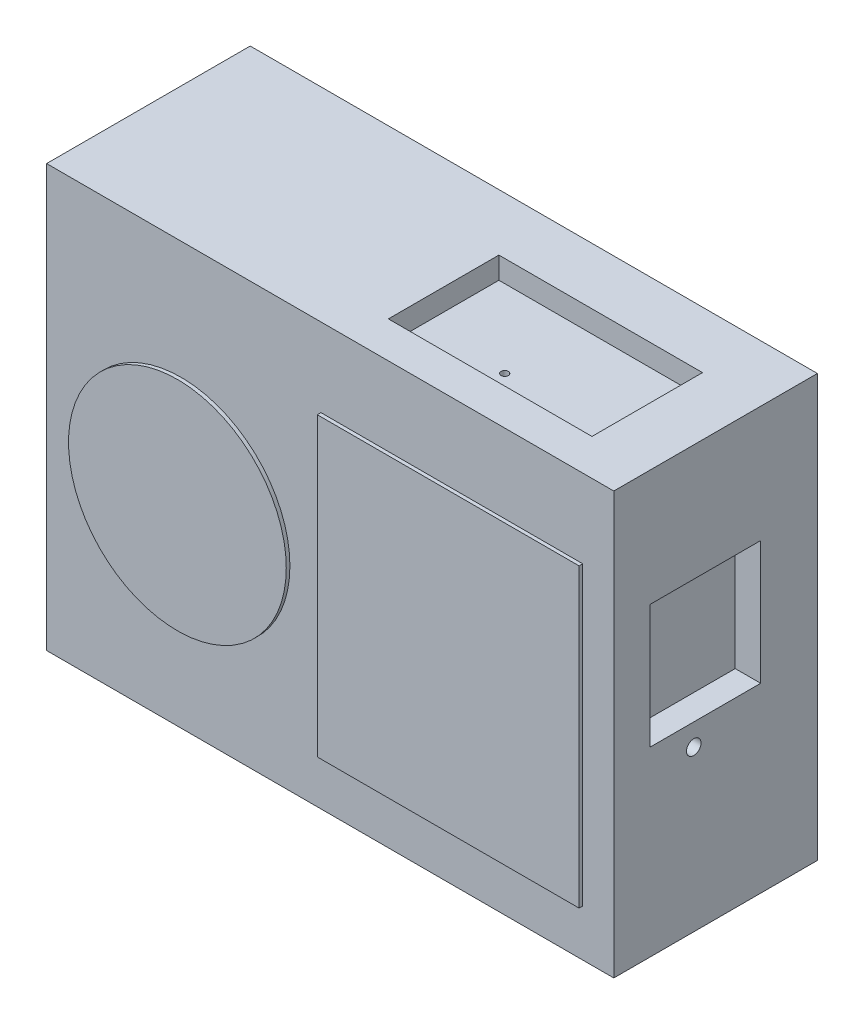
ISO-10303-21;
HEADER;
FILE_DESCRIPTION(('STEP AP214'),'2;1');
FILE_NAME('part.step','',(''),(''),'','','');
FILE_SCHEMA(('AUTOMOTIVE_DESIGN { 1 0 10303 214 1 1 1 1 }'));
ENDSEC;
DATA;
#1=APPLICATION_CONTEXT('core data for automotive mechanical design processes');
#2=APPLICATION_PROTOCOL_DEFINITION('international standard','automotive_design',2000,#1);
#3=PRODUCT_CONTEXT('',#1,'mechanical');
#4=PRODUCT('Part','Part','',(#3));
#5=PRODUCT_RELATED_PRODUCT_CATEGORY('part','',(#4));
#6=PRODUCT_DEFINITION_FORMATION('','',#4);
#7=PRODUCT_DEFINITION_CONTEXT('part definition',#1,'design');
#8=PRODUCT_DEFINITION('design','',#6,#7);
#9=PRODUCT_DEFINITION_SHAPE('','',#8);
#10=(LENGTH_UNIT() NAMED_UNIT(*) SI_UNIT(.MILLI.,.METRE.));
#11=(NAMED_UNIT(*) PLANE_ANGLE_UNIT() SI_UNIT($,.RADIAN.));
#12=(NAMED_UNIT(*) SI_UNIT($,.STERADIAN.) SOLID_ANGLE_UNIT());
#13=UNCERTAINTY_MEASURE_WITH_UNIT(LENGTH_MEASURE(1.E-05),#10,'distance_accuracy_value','');
#14=(GEOMETRIC_REPRESENTATION_CONTEXT(3) GLOBAL_UNCERTAINTY_ASSIGNED_CONTEXT((#13)) GLOBAL_UNIT_ASSIGNED_CONTEXT((#10,
#11,#12)) REPRESENTATION_CONTEXT('',''));
#15=CARTESIAN_POINT('',(0.,0.,0.));
#16=DIRECTION('',(0.,0.,1.));
#17=DIRECTION('',(1.,0.,0.));
#18=AXIS2_PLACEMENT_3D('',#15,#16,#17);
#19=CARTESIAN_POINT('',(0.,0.,28.));
#20=DIRECTION('',(0.,0.,1.));
#21=DIRECTION('',(1.,0.,0.));
#22=AXIS2_PLACEMENT_3D('',#19,#20,#21);
#23=PLANE('',#22);
#24=CARTESIAN_POINT('',(18.4860913344576,-31.1813689095572,28.));
#25=DIRECTION('',(0.,0.,1.));
#26=DIRECTION('',(1.,0.,0.));
#27=AXIS2_PLACEMENT_3D('',#24,#25,#26);
#28=CIRCLE('',#27,14.9728238925207);
#29=CARTESIAN_POINT('',(33.4589152269783,-31.1813689095572,28.));
#30=VERTEX_POINT('',#29);
#31=EDGE_CURVE('E195',#30,#30,#28,.T.);
#32=ORIENTED_EDGE('',*,*,#31,.F.);
#33=EDGE_LOOP('',(#32));
#34=FACE_BOUND('',#33,.T.);
#35=DIRECTION('',(0.,-1.,0.));
#36=VECTOR('',#35,1.);
#37=CARTESIAN_POINT('',(0.,0.,28.));
#38=LINE('',#37,#36);
#39=CARTESIAN_POINT('',(0.,0.,28.));
#40=VERTEX_POINT('',#39);
#41=CARTESIAN_POINT('',(0.,-58.,28.));
#42=VERTEX_POINT('',#41);
#43=EDGE_CURVE('E263',#40,#42,#38,.T.);
#44=ORIENTED_EDGE('',*,*,#43,.T.);
#45=DIRECTION('',(1.,0.,0.));
#46=VECTOR('',#45,1.);
#47=CARTESIAN_POINT('',(0.,-58.,28.));
#48=LINE('',#47,#46);
#49=CARTESIAN_POINT('',(78.,-58.,28.));
#50=VERTEX_POINT('',#49);
#51=EDGE_CURVE('E266',#42,#50,#48,.T.);
#52=ORIENTED_EDGE('',*,*,#51,.T.);
#53=DIRECTION('',(0.,1.,0.));
#54=VECTOR('',#53,1.);
#55=CARTESIAN_POINT('',(78.,0.,28.));
#56=LINE('',#55,#54);
#57=CARTESIAN_POINT('',(78.,0.,28.));
#58=VERTEX_POINT('',#57);
#59=EDGE_CURVE('E269',#50,#58,#56,.T.);
#60=ORIENTED_EDGE('',*,*,#59,.T.);
#61=DIRECTION('',(-1.,0.,0.));
#62=VECTOR('',#61,1.);
#63=CARTESIAN_POINT('',(0.,0.,28.));
#64=LINE('',#63,#62);
#65=EDGE_CURVE('E271',#58,#40,#64,.T.);
#66=ORIENTED_EDGE('',*,*,#65,.T.);
#67=EDGE_LOOP('',(#44,#52,#60,#66));
#68=FACE_BOUND('',#67,.T.);
#69=DIRECTION('',(1.,0.,0.));
#70=VECTOR('',#69,1.);
#71=CARTESIAN_POINT('',(37.7218406669293,-51.5618349360807,28.));
#72=LINE('',#71,#70);
#73=CARTESIAN_POINT('',(37.7218406669293,-51.5618349360807,28.));
#74=VERTEX_POINT('',#73);
#75=CARTESIAN_POINT('',(73.7307735352672,-51.5618349360807,28.));
#76=VERTEX_POINT('',#75);
#77=EDGE_CURVE('E217',#74,#76,#72,.T.);
#78=ORIENTED_EDGE('',*,*,#77,.F.);
#79=DIRECTION('',(0.,-1.,0.));
#80=VECTOR('',#79,1.);
#81=CARTESIAN_POINT('',(37.7218406669293,-10.8009028830338,28.));
#82=LINE('',#81,#80);
#83=CARTESIAN_POINT('',(37.7218406669293,-10.8009028830338,28.));
#84=VERTEX_POINT('',#83);
#85=EDGE_CURVE('E201',#84,#74,#82,.T.);
#86=ORIENTED_EDGE('',*,*,#85,.F.);
#87=DIRECTION('',(-1.,0.,0.));
#88=VECTOR('',#87,1.);
#89=CARTESIAN_POINT('',(37.7218406669293,-10.8009028830338,28.));
#90=LINE('',#89,#88);
#91=CARTESIAN_POINT('',(73.7307735352672,-10.8009028830338,28.));
#92=VERTEX_POINT('',#91);
#93=EDGE_CURVE('E208',#92,#84,#90,.T.);
#94=ORIENTED_EDGE('',*,*,#93,.F.);
#95=DIRECTION('',(0.,1.,0.));
#96=VECTOR('',#95,1.);
#97=CARTESIAN_POINT('',(73.7307735352672,-10.8009028830338,28.));
#98=LINE('',#97,#96);
#99=EDGE_CURVE('E219',#76,#92,#98,.T.);
#100=ORIENTED_EDGE('',*,*,#99,.F.);
#101=EDGE_LOOP('',(#78,#86,#94,#100));
#102=FACE_BOUND('',#101,.T.);
#103=ADVANCED_FACE('F35',(#34,#68,#102),#23,.T.);
#104=CARTESIAN_POINT('',(0.,0.,28.));
#105=DIRECTION('',(1.,0.,0.));
#106=DIRECTION('',(0.,1.,0.));
#107=AXIS2_PLACEMENT_3D('',#104,#105,#106);
#108=PLANE('',#107);
#109=DIRECTION('',(0.,-1.,0.));
#110=VECTOR('',#109,1.);
#111=CARTESIAN_POINT('',(0.,0.,0.));
#112=LINE('',#111,#110);
#113=CARTESIAN_POINT('',(0.,0.,0.));
#114=VERTEX_POINT('',#113);
#115=CARTESIAN_POINT('',(0.,-58.,0.));
#116=VERTEX_POINT('',#115);
#117=EDGE_CURVE('E256',#114,#116,#112,.T.);
#118=ORIENTED_EDGE('',*,*,#117,.T.);
#119=DIRECTION('',(0.,0.,-1.));
#120=VECTOR('',#119,1.);
#121=CARTESIAN_POINT('',(0.,-58.,28.));
#122=LINE('',#121,#120);
#123=EDGE_CURVE('E11',#42,#116,#122,.T.);
#124=ORIENTED_EDGE('',*,*,#123,.F.);
#125=ORIENTED_EDGE('',*,*,#43,.F.);
#126=DIRECTION('',(0.,0.,-1.));
#127=VECTOR('',#126,1.);
#128=CARTESIAN_POINT('',(0.,0.,28.));
#129=LINE('',#128,#127);
#130=EDGE_CURVE('E273',#40,#114,#129,.T.);
#131=ORIENTED_EDGE('',*,*,#130,.T.);
#132=EDGE_LOOP('',(#118,#124,#125,#131));
#133=FACE_BOUND('',#132,.T.);
#134=ADVANCED_FACE('F37',(#133),#108,.F.);
#135=CARTESIAN_POINT('',(0.,-58.,28.));
#136=DIRECTION('',(0.,1.,0.));
#137=DIRECTION('',(0.,0.,1.));
#138=AXIS2_PLACEMENT_3D('',#135,#136,#137);
#139=PLANE('',#138);
#140=DIRECTION('',(1.,0.,0.));
#141=VECTOR('',#140,1.);
#142=CARTESIAN_POINT('',(0.,-58.,0.));
#143=LINE('',#142,#141);
#144=CARTESIAN_POINT('',(78.,-58.,0.));
#145=VERTEX_POINT('',#144);
#146=EDGE_CURVE('E276',#116,#145,#143,.T.);
#147=ORIENTED_EDGE('',*,*,#146,.T.);
#148=DIRECTION('',(0.,0.,-1.));
#149=VECTOR('',#148,1.);
#150=CARTESIAN_POINT('',(78.,-58.,28.));
#151=LINE('',#150,#149);
#152=EDGE_CURVE('E43',#50,#145,#151,.T.);
#153=ORIENTED_EDGE('',*,*,#152,.F.);
#154=ORIENTED_EDGE('',*,*,#51,.F.);
#155=ORIENTED_EDGE('',*,*,#123,.T.);
#156=EDGE_LOOP('',(#147,#153,#154,#155));
#157=FACE_BOUND('',#156,.T.);
#158=ADVANCED_FACE('F306',(#157),#139,.F.);
#159=CARTESIAN_POINT('',(78.,0.,28.));
#160=DIRECTION('',(-1.,0.,0.));
#161=DIRECTION('',(0.,-1.,0.));
#162=AXIS2_PLACEMENT_3D('',#159,#160,#161);
#163=PLANE('',#162);
#164=CARTESIAN_POINT('',(78.,-36.,17.));
#165=DIRECTION('',(1.,0.,0.));
#166=DIRECTION('',(0.,1.,0.));
#167=AXIS2_PLACEMENT_3D('',#164,#165,#166);
#168=CIRCLE('',#167,1.);
#169=CARTESIAN_POINT('',(78.,-35.,17.));
#170=VERTEX_POINT('',#169);
#171=EDGE_CURVE('E175',#170,#170,#168,.T.);
#172=ORIENTED_EDGE('',*,*,#171,.F.);
#173=EDGE_LOOP('',(#172));
#174=FACE_BOUND('',#173,.T.);
#175=DIRECTION('',(0.,0.,1.));
#176=VECTOR('',#175,1.);
#177=CARTESIAN_POINT('',(78.,-16.,7.79999999999999));
#178=LINE('',#177,#176);
#179=CARTESIAN_POINT('',(78.,-16.,7.79999999999999));
#180=VERTEX_POINT('',#179);
#181=CARTESIAN_POINT('',(78.,-16.,23.));
#182=VERTEX_POINT('',#181);
#183=EDGE_CURVE('E181',#180,#182,#178,.T.);
#184=ORIENTED_EDGE('',*,*,#183,.F.);
#185=DIRECTION('',(0.,1.,0.));
#186=VECTOR('',#185,1.);
#187=CARTESIAN_POINT('',(78.,-16.,7.79999999999999));
#188=LINE('',#187,#186);
#189=CARTESIAN_POINT('',(78.,-33.,7.79999999999999));
#190=VERTEX_POINT('',#189);
#191=EDGE_CURVE('E50',#190,#180,#188,.T.);
#192=ORIENTED_EDGE('',*,*,#191,.F.);
#193=DIRECTION('',(0.,0.,-1.));
#194=VECTOR('',#193,1.);
#195=CARTESIAN_POINT('',(78.,-33.,7.79999999999999));
#196=LINE('',#195,#194);
#197=CARTESIAN_POINT('',(78.,-33.,23.));
#198=VERTEX_POINT('',#197);
#199=EDGE_CURVE('E169',#198,#190,#196,.T.);
#200=ORIENTED_EDGE('',*,*,#199,.F.);
#201=DIRECTION('',(0.,-1.,0.));
#202=VECTOR('',#201,1.);
#203=CARTESIAN_POINT('',(78.,-16.,23.));
#204=LINE('',#203,#202);
#205=EDGE_CURVE('E172',#182,#198,#204,.T.);
#206=ORIENTED_EDGE('',*,*,#205,.F.);
#207=EDGE_LOOP('',(#184,#192,#200,#206));
#208=FACE_BOUND('',#207,.T.);
#209=DIRECTION('',(0.,1.,0.));
#210=VECTOR('',#209,1.);
#211=CARTESIAN_POINT('',(78.,0.,0.));
#212=LINE('',#211,#210);
#213=CARTESIAN_POINT('',(78.,0.,0.));
#214=VERTEX_POINT('',#213);
#215=EDGE_CURVE('E278',#145,#214,#212,.T.);
#216=ORIENTED_EDGE('',*,*,#215,.T.);
#217=DIRECTION('',(0.,0.,-1.));
#218=VECTOR('',#217,1.);
#219=CARTESIAN_POINT('',(78.,0.,28.));
#220=LINE('',#219,#218);
#221=EDGE_CURVE('E283',#58,#214,#220,.T.);
#222=ORIENTED_EDGE('',*,*,#221,.F.);
#223=ORIENTED_EDGE('',*,*,#59,.F.);
#224=ORIENTED_EDGE('',*,*,#152,.T.);
#225=EDGE_LOOP('',(#216,#222,#223,#224));
#226=FACE_BOUND('',#225,.T.);
#227=ADVANCED_FACE('F290',(#174,#208,#226),#163,.F.);
#228=CARTESIAN_POINT('',(0.,0.,28.));
#229=DIRECTION('',(0.,-1.,0.));
#230=DIRECTION('',(0.,0.,-1.));
#231=AXIS2_PLACEMENT_3D('',#228,#229,#230);
#232=PLANE('',#231);
#233=DIRECTION('',(1.,0.,0.));
#234=VECTOR('',#233,1.);
#235=CARTESIAN_POINT('',(42.,0.,23.));
#236=LINE('',#235,#234);
#237=CARTESIAN_POINT('',(42.,0.,23.));
#238=VERTEX_POINT('',#237);
#239=CARTESIAN_POINT('',(70.,0.,23.));
#240=VERTEX_POINT('',#239);
#241=EDGE_CURVE('E246',#238,#240,#236,.T.);
#242=ORIENTED_EDGE('',*,*,#241,.F.);
#243=DIRECTION('',(0.,0.,1.));
#244=VECTOR('',#243,1.);
#245=CARTESIAN_POINT('',(42.,0.,7.8));
#246=LINE('',#245,#244);
#247=CARTESIAN_POINT('',(42.,0.,7.8));
#248=VERTEX_POINT('',#247);
#249=EDGE_CURVE('E230',#248,#238,#246,.T.);
#250=ORIENTED_EDGE('',*,*,#249,.F.);
#251=DIRECTION('',(-1.,0.,0.));
#252=VECTOR('',#251,1.);
#253=CARTESIAN_POINT('',(42.,0.,7.8));
#254=LINE('',#253,#252);
#255=CARTESIAN_POINT('',(70.,0.,7.8));
#256=VERTEX_POINT('',#255);
#257=EDGE_CURVE('E235',#256,#248,#254,.T.);
#258=ORIENTED_EDGE('',*,*,#257,.F.);
#259=DIRECTION('',(0.,0.,-1.));
#260=VECTOR('',#259,1.);
#261=CARTESIAN_POINT('',(70.,0.,7.8));
#262=LINE('',#261,#260);
#263=EDGE_CURVE('E249',#240,#256,#262,.T.);
#264=ORIENTED_EDGE('',*,*,#263,.F.);
#265=EDGE_LOOP('',(#242,#250,#258,#264));
#266=FACE_BOUND('',#265,.T.);
#267=DIRECTION('',(-1.,0.,0.));
#268=VECTOR('',#267,1.);
#269=CARTESIAN_POINT('',(0.,0.,0.));
#270=LINE('',#269,#268);
#271=EDGE_CURVE('E267',#214,#114,#270,.T.);
#272=ORIENTED_EDGE('',*,*,#271,.T.);
#273=ORIENTED_EDGE('',*,*,#130,.F.);
#274=ORIENTED_EDGE('',*,*,#65,.F.);
#275=ORIENTED_EDGE('',*,*,#221,.T.);
#276=EDGE_LOOP('',(#272,#273,#274,#275));
#277=FACE_BOUND('',#276,.T.);
#278=ADVANCED_FACE('F299',(#266,#277),#232,.F.);
#279=CARTESIAN_POINT('',(0.,0.,0.));
#280=DIRECTION('',(0.,0.,1.));
#281=DIRECTION('',(1.,0.,0.));
#282=AXIS2_PLACEMENT_3D('',#279,#280,#281);
#283=PLANE('',#282);
#284=ORIENTED_EDGE('',*,*,#117,.F.);
#285=ORIENTED_EDGE('',*,*,#271,.F.);
#286=ORIENTED_EDGE('',*,*,#215,.F.);
#287=ORIENTED_EDGE('',*,*,#146,.F.);
#288=EDGE_LOOP('',(#284,#285,#286,#287));
#289=FACE_BOUND('',#288,.T.);
#290=ADVANCED_FACE('F296',(#289),#283,.F.);
#291=CARTESIAN_POINT('',(42.,-3.,7.8));
#292=DIRECTION('',(-1.,0.,0.));
#293=DIRECTION('',(0.,0.,1.));
#294=AXIS2_PLACEMENT_3D('',#291,#292,#293);
#295=PLANE('',#294);
#296=ORIENTED_EDGE('',*,*,#249,.T.);
#297=DIRECTION('',(0.,1.,0.));
#298=VECTOR('',#297,1.);
#299=CARTESIAN_POINT('',(42.,-3.,23.));
#300=LINE('',#299,#298);
#301=CARTESIAN_POINT('',(42.,-3.,23.));
#302=VERTEX_POINT('',#301);
#303=EDGE_CURVE('E244',#302,#238,#300,.T.);
#304=ORIENTED_EDGE('',*,*,#303,.F.);
#305=DIRECTION('',(0.,0.,1.));
#306=VECTOR('',#305,1.);
#307=CARTESIAN_POINT('',(42.,-3.,7.8));
#308=LINE('',#307,#306);
#309=CARTESIAN_POINT('',(42.,-3.,7.8));
#310=VERTEX_POINT('',#309);
#311=EDGE_CURVE('E231',#310,#302,#308,.T.);
#312=ORIENTED_EDGE('',*,*,#311,.F.);
#313=DIRECTION('',(0.,1.,0.));
#314=VECTOR('',#313,1.);
#315=CARTESIAN_POINT('',(42.,-3.,7.8));
#316=LINE('',#315,#314);
#317=EDGE_CURVE('E254',#310,#248,#316,.T.);
#318=ORIENTED_EDGE('',*,*,#317,.T.);
#319=EDGE_LOOP('',(#296,#304,#312,#318));
#320=FACE_BOUND('',#319,.T.);
#321=ADVANCED_FACE('F322',(#320),#295,.F.);
#322=CARTESIAN_POINT('',(42.,-3.,7.8));
#323=DIRECTION('',(0.,0.,-1.));
#324=DIRECTION('',(-1.,0.,0.));
#325=AXIS2_PLACEMENT_3D('',#322,#323,#324);
#326=PLANE('',#325);
#327=ORIENTED_EDGE('',*,*,#257,.T.);
#328=ORIENTED_EDGE('',*,*,#317,.F.);
#329=DIRECTION('',(-1.,0.,0.));
#330=VECTOR('',#329,1.);
#331=CARTESIAN_POINT('',(42.,-3.,7.8));
#332=LINE('',#331,#330);
#333=CARTESIAN_POINT('',(70.,-3.,7.8));
#334=VERTEX_POINT('',#333);
#335=EDGE_CURVE('E241',#334,#310,#332,.T.);
#336=ORIENTED_EDGE('',*,*,#335,.F.);
#337=DIRECTION('',(0.,1.,0.));
#338=VECTOR('',#337,1.);
#339=CARTESIAN_POINT('',(70.,-3.,7.8));
#340=LINE('',#339,#338);
#341=EDGE_CURVE('E257',#334,#256,#340,.T.);
#342=ORIENTED_EDGE('',*,*,#341,.T.);
#343=EDGE_LOOP('',(#327,#328,#336,#342));
#344=FACE_BOUND('',#343,.T.);
#345=ADVANCED_FACE('F342',(#344),#326,.F.);
#346=CARTESIAN_POINT('',(70.,-3.,7.8));
#347=DIRECTION('',(1.,0.,0.));
#348=DIRECTION('',(0.,0.,-1.));
#349=AXIS2_PLACEMENT_3D('',#346,#347,#348);
#350=PLANE('',#349);
#351=ORIENTED_EDGE('',*,*,#263,.T.);
#352=ORIENTED_EDGE('',*,*,#341,.F.);
#353=DIRECTION('',(0.,0.,-1.));
#354=VECTOR('',#353,1.);
#355=CARTESIAN_POINT('',(70.,-3.,7.8));
#356=LINE('',#355,#354);
#357=CARTESIAN_POINT('',(70.,-3.,23.));
#358=VERTEX_POINT('',#357);
#359=EDGE_CURVE('E238',#358,#334,#356,.T.);
#360=ORIENTED_EDGE('',*,*,#359,.F.);
#361=DIRECTION('',(0.,1.,0.));
#362=VECTOR('',#361,1.);
#363=CARTESIAN_POINT('',(70.,-3.,23.));
#364=LINE('',#363,#362);
#365=EDGE_CURVE('E259',#358,#240,#364,.T.);
#366=ORIENTED_EDGE('',*,*,#365,.T.);
#367=EDGE_LOOP('',(#351,#352,#360,#366));
#368=FACE_BOUND('',#367,.T.);
#369=ADVANCED_FACE('F344',(#368),#350,.F.);
#370=CARTESIAN_POINT('',(42.,-3.,23.));
#371=DIRECTION('',(0.,0.,1.));
#372=DIRECTION('',(1.,0.,0.));
#373=AXIS2_PLACEMENT_3D('',#370,#371,#372);
#374=PLANE('',#373);
#375=ORIENTED_EDGE('',*,*,#241,.T.);
#376=ORIENTED_EDGE('',*,*,#365,.F.);
#377=DIRECTION('',(1.,0.,0.));
#378=VECTOR('',#377,1.);
#379=CARTESIAN_POINT('',(42.,-3.,23.));
#380=LINE('',#379,#378);
#381=EDGE_CURVE('E234',#302,#358,#380,.T.);
#382=ORIENTED_EDGE('',*,*,#381,.F.);
#383=ORIENTED_EDGE('',*,*,#303,.T.);
#384=EDGE_LOOP('',(#375,#376,#382,#383));
#385=FACE_BOUND('',#384,.T.);
#386=ADVANCED_FACE('F335',(#385),#374,.F.);
#387=CARTESIAN_POINT('',(0.,-3.,0.));
#388=DIRECTION('',(0.,1.,0.));
#389=DIRECTION('',(0.,0.,1.));
#390=AXIS2_PLACEMENT_3D('',#387,#388,#389);
#391=PLANE('',#390);
#392=CARTESIAN_POINT('',(53.5,-3.,18.5));
#393=DIRECTION('',(0.,1.,0.));
#394=DIRECTION('',(0.,0.,1.));
#395=AXIS2_PLACEMENT_3D('',#392,#393,#394);
#396=CIRCLE('',#395,0.499999999999999);
#397=CARTESIAN_POINT('',(53.5,-3.,19.));
#398=VERTEX_POINT('',#397);
#399=EDGE_CURVE('E188',#398,#398,#396,.T.);
#400=ORIENTED_EDGE('',*,*,#399,.F.);
#401=EDGE_LOOP('',(#400));
#402=FACE_BOUND('',#401,.T.);
#403=ORIENTED_EDGE('',*,*,#311,.T.);
#404=ORIENTED_EDGE('',*,*,#381,.T.);
#405=ORIENTED_EDGE('',*,*,#359,.T.);
#406=ORIENTED_EDGE('',*,*,#335,.T.);
#407=EDGE_LOOP('',(#403,#404,#405,#406));
#408=FACE_BOUND('',#407,.T.);
#409=ADVANCED_FACE('F346',(#402,#408),#391,.T.);
#410=CARTESIAN_POINT('',(37.7218406669293,-10.8009028830338,28.5));
#411=DIRECTION('',(1.,0.,0.));
#412=DIRECTION('',(0.,0.,-1.));
#413=AXIS2_PLACEMENT_3D('',#410,#411,#412);
#414=PLANE('',#413);
#415=ORIENTED_EDGE('',*,*,#85,.T.);
#416=DIRECTION('',(0.,0.,-1.));
#417=VECTOR('',#416,1.);
#418=CARTESIAN_POINT('',(37.7218406669293,-51.5618349360807,28.5));
#419=LINE('',#418,#417);
#420=CARTESIAN_POINT('',(37.7218406669293,-51.5618349360807,28.5));
#421=VERTEX_POINT('',#420);
#422=EDGE_CURVE('E228',#421,#74,#419,.T.);
#423=ORIENTED_EDGE('',*,*,#422,.F.);
#424=DIRECTION('',(0.,-1.,0.));
#425=VECTOR('',#424,1.);
#426=CARTESIAN_POINT('',(37.7218406669293,-10.8009028830338,28.5));
#427=LINE('',#426,#425);
#428=CARTESIAN_POINT('',(37.7218406669293,-10.8009028830338,28.5));
#429=VERTEX_POINT('',#428);
#430=EDGE_CURVE('E204',#429,#421,#427,.T.);
#431=ORIENTED_EDGE('',*,*,#430,.F.);
#432=DIRECTION('',(0.,0.,-1.));
#433=VECTOR('',#432,1.);
#434=CARTESIAN_POINT('',(37.7218406669293,-10.8009028830338,28.5));
#435=LINE('',#434,#433);
#436=EDGE_CURVE('E214',#429,#84,#435,.T.);
#437=ORIENTED_EDGE('',*,*,#436,.T.);
#438=EDGE_LOOP('',(#415,#423,#431,#437));
#439=FACE_BOUND('',#438,.T.);
#440=ADVANCED_FACE('F348',(#439),#414,.F.);
#441=CARTESIAN_POINT('',(37.7218406669293,-51.5618349360807,28.5));
#442=DIRECTION('',(0.,1.,0.));
#443=DIRECTION('',(0.,0.,1.));
#444=AXIS2_PLACEMENT_3D('',#441,#442,#443);
#445=PLANE('',#444);
#446=ORIENTED_EDGE('',*,*,#77,.T.);
#447=DIRECTION('',(0.,0.,-1.));
#448=VECTOR('',#447,1.);
#449=CARTESIAN_POINT('',(73.7307735352672,-51.5618349360807,28.5));
#450=LINE('',#449,#448);
#451=CARTESIAN_POINT('',(73.7307735352672,-51.5618349360807,28.5));
#452=VERTEX_POINT('',#451);
#453=EDGE_CURVE('E225',#452,#76,#450,.T.);
#454=ORIENTED_EDGE('',*,*,#453,.F.);
#455=DIRECTION('',(1.,0.,0.));
#456=VECTOR('',#455,1.);
#457=CARTESIAN_POINT('',(37.7218406669293,-51.5618349360807,28.5));
#458=LINE('',#457,#456);
#459=EDGE_CURVE('E207',#421,#452,#458,.T.);
#460=ORIENTED_EDGE('',*,*,#459,.F.);
#461=ORIENTED_EDGE('',*,*,#422,.T.);
#462=EDGE_LOOP('',(#446,#454,#460,#461));
#463=FACE_BOUND('',#462,.T.);
#464=ADVANCED_FACE('F355',(#463),#445,.F.);
#465=CARTESIAN_POINT('',(73.7307735352672,-10.8009028830338,28.5));
#466=DIRECTION('',(-1.,0.,0.));
#467=DIRECTION('',(0.,0.,1.));
#468=AXIS2_PLACEMENT_3D('',#465,#466,#467);
#469=PLANE('',#468);
#470=ORIENTED_EDGE('',*,*,#99,.T.);
#471=DIRECTION('',(0.,0.,-1.));
#472=VECTOR('',#471,1.);
#473=CARTESIAN_POINT('',(73.7307735352672,-10.8009028830338,28.5));
#474=LINE('',#473,#472);
#475=CARTESIAN_POINT('',(73.7307735352672,-10.8009028830338,28.5));
#476=VERTEX_POINT('',#475);
#477=EDGE_CURVE('E58',#476,#92,#474,.T.);
#478=ORIENTED_EDGE('',*,*,#477,.F.);
#479=DIRECTION('',(0.,1.,0.));
#480=VECTOR('',#479,1.);
#481=CARTESIAN_POINT('',(73.7307735352672,-10.8009028830338,28.5));
#482=LINE('',#481,#480);
#483=EDGE_CURVE('E210',#452,#476,#482,.T.);
#484=ORIENTED_EDGE('',*,*,#483,.F.);
#485=ORIENTED_EDGE('',*,*,#453,.T.);
#486=EDGE_LOOP('',(#470,#478,#484,#485));
#487=FACE_BOUND('',#486,.T.);
#488=ADVANCED_FACE('F393',(#487),#469,.F.);
#489=CARTESIAN_POINT('',(37.7218406669293,-10.8009028830338,28.5));
#490=DIRECTION('',(0.,-1.,0.));
#491=DIRECTION('',(0.,0.,-1.));
#492=AXIS2_PLACEMENT_3D('',#489,#490,#491);
#493=PLANE('',#492);
#494=ORIENTED_EDGE('',*,*,#93,.T.);
#495=ORIENTED_EDGE('',*,*,#436,.F.);
#496=DIRECTION('',(-1.,0.,0.));
#497=VECTOR('',#496,1.);
#498=CARTESIAN_POINT('',(37.7218406669293,-10.8009028830338,28.5));
#499=LINE('',#498,#497);
#500=EDGE_CURVE('E212',#476,#429,#499,.T.);
#501=ORIENTED_EDGE('',*,*,#500,.F.);
#502=ORIENTED_EDGE('',*,*,#477,.T.);
#503=EDGE_LOOP('',(#494,#495,#501,#502));
#504=FACE_BOUND('',#503,.T.);
#505=ADVANCED_FACE('F402',(#504),#493,.F.);
#506=CARTESIAN_POINT('',(0.,0.,28.5));
#507=DIRECTION('',(0.,0.,1.));
#508=DIRECTION('',(1.,0.,0.));
#509=AXIS2_PLACEMENT_3D('',#506,#507,#508);
#510=PLANE('',#509);
#511=ORIENTED_EDGE('',*,*,#430,.T.);
#512=ORIENTED_EDGE('',*,*,#459,.T.);
#513=ORIENTED_EDGE('',*,*,#483,.T.);
#514=ORIENTED_EDGE('',*,*,#500,.T.);
#515=EDGE_LOOP('',(#511,#512,#513,#514));
#516=FACE_BOUND('',#515,.T.);
#517=ADVANCED_FACE('F412',(#516),#510,.T.);
#518=CARTESIAN_POINT('',(18.4860913344576,-31.1813689095572,28.5));
#519=DIRECTION('',(0.,0.,-1.));
#520=DIRECTION('',(-1.,0.,0.));
#521=AXIS2_PLACEMENT_3D('',#518,#519,#520);
#522=CYLINDRICAL_SURFACE('',#521,14.9728238925207);
#523=CARTESIAN_POINT('',(18.4860913344576,-31.1813689095572,28.5));
#524=DIRECTION('',(0.,0.,1.));
#525=DIRECTION('',(1.,0.,0.));
#526=AXIS2_PLACEMENT_3D('',#523,#524,#525);
#527=CIRCLE('',#526,14.9728238925207);
#528=CARTESIAN_POINT('',(33.4589152269783,-31.1813689095572,28.5));
#529=VERTEX_POINT('',#528);
#530=EDGE_CURVE('E198',#529,#529,#527,.T.);
#531=ORIENTED_EDGE('',*,*,#530,.F.);
#532=EDGE_LOOP('',(#531));
#533=FACE_BOUND('',#532,.T.);
#534=ORIENTED_EDGE('',*,*,#31,.T.);
#535=EDGE_LOOP('',(#534));
#536=FACE_BOUND('',#535,.T.);
#537=ADVANCED_FACE('F421',(#533,#536),#522,.T.);
#538=CARTESIAN_POINT('',(18.4860913344576,-31.1813689095572,28.5));
#539=DIRECTION('',(0.,0.,1.));
#540=DIRECTION('',(1.,0.,0.));
#541=AXIS2_PLACEMENT_3D('',#538,#539,#540);
#542=PLANE('',#541);
#543=ORIENTED_EDGE('',*,*,#530,.T.);
#544=EDGE_LOOP('',(#543));
#545=FACE_BOUND('',#544,.T.);
#546=ADVANCED_FACE('F431',(#545),#542,.T.);
#547=CARTESIAN_POINT('',(53.5,-8.,18.5));
#548=DIRECTION('',(0.,1.,0.));
#549=DIRECTION('',(0.,0.,1.));
#550=AXIS2_PLACEMENT_3D('',#547,#548,#549);
#551=CYLINDRICAL_SURFACE('',#550,0.499999999999999);
#552=CARTESIAN_POINT('',(53.5,-8.,18.5));
#553=DIRECTION('',(0.,1.,0.));
#554=DIRECTION('',(0.,0.,1.));
#555=AXIS2_PLACEMENT_3D('',#552,#553,#554);
#556=CIRCLE('',#555,0.499999999999999);
#557=CARTESIAN_POINT('',(53.5,-8.,19.));
#558=VERTEX_POINT('',#557);
#559=EDGE_CURVE('E192',#558,#558,#556,.T.);
#560=ORIENTED_EDGE('',*,*,#559,.F.);
#561=EDGE_LOOP('',(#560));
#562=FACE_BOUND('',#561,.T.);
#563=ORIENTED_EDGE('',*,*,#399,.T.);
#564=EDGE_LOOP('',(#563));
#565=FACE_BOUND('',#564,.T.);
#566=ADVANCED_FACE('F440',(#562,#565),#551,.F.);
#567=CARTESIAN_POINT('',(53.5,-8.,18.5));
#568=DIRECTION('',(0.,1.,0.));
#569=DIRECTION('',(0.,0.,1.));
#570=AXIS2_PLACEMENT_3D('',#567,#568,#569);
#571=PLANE('',#570);
#572=ORIENTED_EDGE('',*,*,#559,.T.);
#573=EDGE_LOOP('',(#572));
#574=FACE_BOUND('',#573,.T.);
#575=ADVANCED_FACE('F454',(#574),#571,.T.);
#576=CARTESIAN_POINT('',(74.5,-16.,7.79999999999999));
#577=DIRECTION('',(0.,0.,-1.));
#578=DIRECTION('',(0.,1.,0.));
#579=AXIS2_PLACEMENT_3D('',#576,#577,#578);
#580=PLANE('',#579);
#581=ORIENTED_EDGE('',*,*,#191,.T.);
#582=DIRECTION('',(1.,0.,0.));
#583=VECTOR('',#582,1.);
#584=CARTESIAN_POINT('',(74.5,-16.,7.79999999999999));
#585=LINE('',#584,#583);
#586=CARTESIAN_POINT('',(74.5,-16.,7.79999999999999));
#587=VERTEX_POINT('',#586);
#588=EDGE_CURVE('E147',#587,#180,#585,.T.);
#589=ORIENTED_EDGE('',*,*,#588,.F.);
#590=DIRECTION('',(0.,1.,0.));
#591=VECTOR('',#590,1.);
#592=CARTESIAN_POINT('',(74.5,-16.,7.79999999999999));
#593=LINE('',#592,#591);
#594=CARTESIAN_POINT('',(74.5,-33.,7.79999999999999));
#595=VERTEX_POINT('',#594);
#596=EDGE_CURVE('E151',#595,#587,#593,.T.);
#597=ORIENTED_EDGE('',*,*,#596,.F.);
#598=DIRECTION('',(1.,0.,0.));
#599=VECTOR('',#598,1.);
#600=CARTESIAN_POINT('',(74.5,-33.,7.79999999999999));
#601=LINE('',#600,#599);
#602=EDGE_CURVE('E186',#595,#190,#601,.T.);
#603=ORIENTED_EDGE('',*,*,#602,.T.);
#604=EDGE_LOOP('',(#581,#589,#597,#603));
#605=FACE_BOUND('',#604,.T.);
#606=ADVANCED_FACE('F149',(#605),#580,.F.);
#607=CARTESIAN_POINT('',(74.5,-33.,7.79999999999999));
#608=DIRECTION('',(0.,-1.,0.));
#609=DIRECTION('',(0.,0.,-1.));
#610=AXIS2_PLACEMENT_3D('',#607,#608,#609);
#611=PLANE('',#610);
#612=ORIENTED_EDGE('',*,*,#199,.T.);
#613=ORIENTED_EDGE('',*,*,#602,.F.);
#614=DIRECTION('',(0.,0.,-1.));
#615=VECTOR('',#614,1.);
#616=CARTESIAN_POINT('',(74.5,-33.,7.79999999999999));
#617=LINE('',#616,#615);
#618=CARTESIAN_POINT('',(74.5,-33.,23.));
#619=VERTEX_POINT('',#618);
#620=EDGE_CURVE('E157',#619,#595,#617,.T.);
#621=ORIENTED_EDGE('',*,*,#620,.F.);
#622=DIRECTION('',(1.,0.,0.));
#623=VECTOR('',#622,1.);
#624=CARTESIAN_POINT('',(74.5,-33.,23.));
#625=LINE('',#624,#623);
#626=EDGE_CURVE('E189',#619,#198,#625,.T.);
#627=ORIENTED_EDGE('',*,*,#626,.T.);
#628=EDGE_LOOP('',(#612,#613,#621,#627));
#629=FACE_BOUND('',#628,.T.);
#630=ADVANCED_FACE('F481',(#629),#611,.F.);
#631=CARTESIAN_POINT('',(74.5,-16.,23.));
#632=DIRECTION('',(0.,0.,1.));
#633=DIRECTION('',(0.,-1.,0.));
#634=AXIS2_PLACEMENT_3D('',#631,#632,#633);
#635=PLANE('',#634);
#636=ORIENTED_EDGE('',*,*,#205,.T.);
#637=ORIENTED_EDGE('',*,*,#626,.F.);
#638=DIRECTION('',(0.,-1.,0.));
#639=VECTOR('',#638,1.);
#640=CARTESIAN_POINT('',(74.5,-16.,23.));
#641=LINE('',#640,#639);
#642=CARTESIAN_POINT('',(74.5,-16.,23.));
#643=VERTEX_POINT('',#642);
#644=EDGE_CURVE('E165',#643,#619,#641,.T.);
#645=ORIENTED_EDGE('',*,*,#644,.F.);
#646=DIRECTION('',(1.,0.,0.));
#647=VECTOR('',#646,1.);
#648=CARTESIAN_POINT('',(74.5,-16.,23.));
#649=LINE('',#648,#647);
#650=EDGE_CURVE('E156',#643,#182,#649,.T.);
#651=ORIENTED_EDGE('',*,*,#650,.T.);
#652=EDGE_LOOP('',(#636,#637,#645,#651));
#653=FACE_BOUND('',#652,.T.);
#654=ADVANCED_FACE('F490',(#653),#635,.F.);
#655=CARTESIAN_POINT('',(74.5,-16.,7.79999999999999));
#656=DIRECTION('',(0.,1.,0.));
#657=DIRECTION('',(-1.,0.,0.));
#658=AXIS2_PLACEMENT_3D('',#655,#656,#657);
#659=PLANE('',#658);
#660=ORIENTED_EDGE('',*,*,#183,.T.);
#661=ORIENTED_EDGE('',*,*,#650,.F.);
#662=DIRECTION('',(0.,0.,1.));
#663=VECTOR('',#662,1.);
#664=CARTESIAN_POINT('',(74.5,-16.,7.79999999999999));
#665=LINE('',#664,#663);
#666=EDGE_CURVE('E160',#587,#643,#665,.T.);
#667=ORIENTED_EDGE('',*,*,#666,.F.);
#668=ORIENTED_EDGE('',*,*,#588,.T.);
#669=EDGE_LOOP('',(#660,#661,#667,#668));
#670=FACE_BOUND('',#669,.T.);
#671=ADVANCED_FACE('F161',(#670),#659,.F.);
#672=CARTESIAN_POINT('',(74.5,0.,0.));
#673=DIRECTION('',(-1.,0.,0.));
#674=DIRECTION('',(0.,-1.,0.));
#675=AXIS2_PLACEMENT_3D('',#672,#673,#674);
#676=PLANE('',#675);
#677=ORIENTED_EDGE('',*,*,#596,.T.);
#678=ORIENTED_EDGE('',*,*,#666,.T.);
#679=ORIENTED_EDGE('',*,*,#644,.T.);
#680=ORIENTED_EDGE('',*,*,#620,.T.);
#681=EDGE_LOOP('',(#677,#678,#679,#680));
#682=FACE_BOUND('',#681,.T.);
#683=ADVANCED_FACE('F167',(#682),#676,.F.);
#684=CARTESIAN_POINT('',(74.5,-36.,17.));
#685=DIRECTION('',(1.,0.,0.));
#686=DIRECTION('',(0.,1.,0.));
#687=AXIS2_PLACEMENT_3D('',#684,#685,#686);
#688=CYLINDRICAL_SURFACE('',#687,1.);
#689=CARTESIAN_POINT('',(74.5,-36.,17.));
#690=DIRECTION('',(1.,0.,0.));
#691=DIRECTION('',(0.,1.,0.));
#692=AXIS2_PLACEMENT_3D('',#689,#690,#691);
#693=CIRCLE('',#692,1.);
#694=CARTESIAN_POINT('',(74.5,-35.,17.));
#695=VERTEX_POINT('',#694);
#696=EDGE_CURVE('E182',#695,#695,#693,.T.);
#697=ORIENTED_EDGE('',*,*,#696,.F.);
#698=EDGE_LOOP('',(#697));
#699=FACE_BOUND('',#698,.T.);
#700=ORIENTED_EDGE('',*,*,#171,.T.);
#701=EDGE_LOOP('',(#700));
#702=FACE_BOUND('',#701,.T.);
#703=ADVANCED_FACE('F517',(#699,#702),#688,.F.);
#704=CARTESIAN_POINT('',(74.5,-36.,17.));
#705=DIRECTION('',(1.,0.,0.));
#706=DIRECTION('',(0.,1.,0.));
#707=AXIS2_PLACEMENT_3D('',#704,#705,#706);
#708=PLANE('',#707);
#709=ORIENTED_EDGE('',*,*,#696,.T.);
#710=EDGE_LOOP('',(#709));
#711=FACE_BOUND('',#710,.T.);
#712=ADVANCED_FACE('F526',(#711),#708,.T.);
#713=CLOSED_SHELL('',(#103,#134,#158,#227,#278,#290,#321,#345,#369,#386,#409,#440,#464,#488,
#505,#517,#537,#546,#566,#575,#606,#630,#654,#671,#683,#703,#712));
#714=MANIFOLD_SOLID_BREP('B2',#713);
#715=ADVANCED_BREP_SHAPE_REPRESENTATION('',(#18,#714),#14);
#716=SHAPE_DEFINITION_REPRESENTATION(#9,#715);
ENDSEC;
END-ISO-10303-21;
